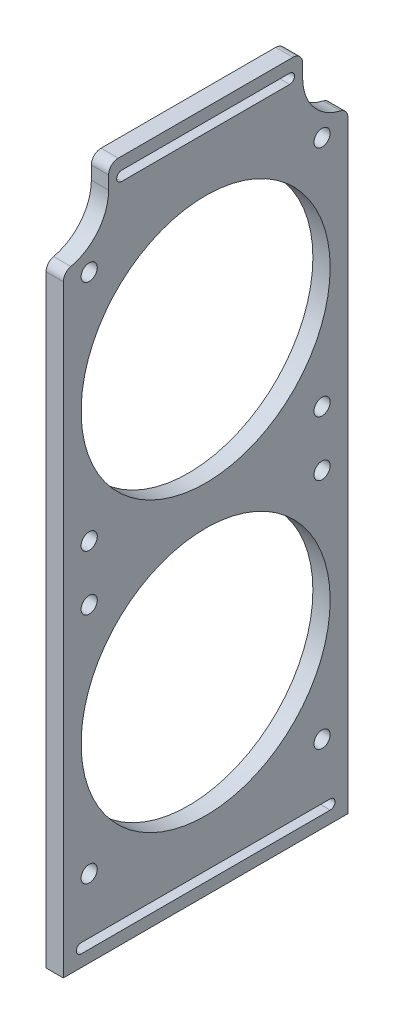
ISO-10303-21;
HEADER;
FILE_DESCRIPTION(('STEP AP214'),'2;1');
FILE_NAME('part.step','',(''),(''),'','','');
FILE_SCHEMA(('AUTOMOTIVE_DESIGN { 1 0 10303 214 1 1 1 1 }'));
ENDSEC;
DATA;
#1=APPLICATION_CONTEXT('core data for automotive mechanical design processes');
#2=APPLICATION_PROTOCOL_DEFINITION('international standard','automotive_design',2000,#1);
#3=PRODUCT_CONTEXT('',#1,'mechanical');
#4=PRODUCT('Part','Part','',(#3));
#5=PRODUCT_RELATED_PRODUCT_CATEGORY('part','',(#4));
#6=PRODUCT_DEFINITION_FORMATION('','',#4);
#7=PRODUCT_DEFINITION_CONTEXT('part definition',#1,'design');
#8=PRODUCT_DEFINITION('design','',#6,#7);
#9=PRODUCT_DEFINITION_SHAPE('','',#8);
#10=(LENGTH_UNIT() NAMED_UNIT(*) SI_UNIT(.MILLI.,.METRE.));
#11=(NAMED_UNIT(*) PLANE_ANGLE_UNIT() SI_UNIT($,.RADIAN.));
#12=(NAMED_UNIT(*) SI_UNIT($,.STERADIAN.) SOLID_ANGLE_UNIT());
#13=UNCERTAINTY_MEASURE_WITH_UNIT(LENGTH_MEASURE(1.E-05),#10,'distance_accuracy_value','');
#14=(GEOMETRIC_REPRESENTATION_CONTEXT(3) GLOBAL_UNCERTAINTY_ASSIGNED_CONTEXT((#13)) GLOBAL_UNIT_ASSIGNED_CONTEXT((#10,
#11,#12)) REPRESENTATION_CONTEXT('',''));
#15=CARTESIAN_POINT('',(0.,0.,0.));
#16=DIRECTION('',(0.,0.,1.));
#17=DIRECTION('',(1.,0.,0.));
#18=AXIS2_PLACEMENT_3D('',#15,#16,#17);
#19=CARTESIAN_POINT('',(5.334,0.,0.));
#20=DIRECTION('',(1.,0.,0.));
#21=DIRECTION('',(0.,0.,-1.));
#22=AXIS2_PLACEMENT_3D('',#19,#20,#21);
#23=PLANE('',#22);
#24=CARTESIAN_POINT('',(5.334,90.3907369232384,-34.4908597531381));
#25=DIRECTION('',(-1.,0.,0.));
#26=DIRECTION('',(0.,0.,1.));
#27=AXIS2_PLACEMENT_3D('',#24,#25,#26);
#28=CIRCLE('',#27,2.5);
#29=CARTESIAN_POINT('',(5.334,90.3907369232384,-31.9908597531381));
#30=VERTEX_POINT('',#29);
#31=EDGE_CURVE('E785',#30,#30,#28,.T.);
#32=ORIENTED_EDGE('',*,*,#31,.T.);
#33=EDGE_LOOP('',(#32));
#34=FACE_BOUND('',#33,.T.);
#35=CARTESIAN_POINT('',(5.334,90.3907369232384,37.5091402468618));
#36=DIRECTION('',(-1.,0.,0.));
#37=DIRECTION('',(0.,0.,1.));
#38=AXIS2_PLACEMENT_3D('',#35,#36,#37);
#39=CIRCLE('',#38,2.5);
#40=CARTESIAN_POINT('',(5.334,90.3907369232384,40.0091402468618));
#41=VERTEX_POINT('',#40);
#42=EDGE_CURVE('E779',#41,#41,#39,.T.);
#43=ORIENTED_EDGE('',*,*,#42,.T.);
#44=EDGE_LOOP('',(#43));
#45=FACE_BOUND('',#44,.T.);
#46=CARTESIAN_POINT('',(5.334,18.3907369232386,-34.4908597531381));
#47=DIRECTION('',(-1.,0.,0.));
#48=DIRECTION('',(0.,0.,1.));
#49=AXIS2_PLACEMENT_3D('',#46,#47,#48);
#50=CIRCLE('',#49,2.5);
#51=CARTESIAN_POINT('',(5.334,18.3907369232386,-31.9908597531381));
#52=VERTEX_POINT('',#51);
#53=EDGE_CURVE('E773',#52,#52,#50,.T.);
#54=ORIENTED_EDGE('',*,*,#53,.T.);
#55=EDGE_LOOP('',(#54));
#56=FACE_BOUND('',#55,.T.);
#57=CARTESIAN_POINT('',(5.334,18.3907369232386,37.5091402468618));
#58=DIRECTION('',(-1.,0.,0.));
#59=DIRECTION('',(0.,0.,1.));
#60=AXIS2_PLACEMENT_3D('',#57,#58,#59);
#61=CIRCLE('',#60,2.5);
#62=CARTESIAN_POINT('',(5.334,18.3907369232386,40.0091402468618));
#63=VERTEX_POINT('',#62);
#64=EDGE_CURVE('E767',#63,#63,#61,.T.);
#65=ORIENTED_EDGE('',*,*,#64,.T.);
#66=EDGE_LOOP('',(#65));
#67=FACE_BOUND('',#66,.T.);
#68=CARTESIAN_POINT('',(5.334,1.32381761759778,37.5091402468619));
#69=DIRECTION('',(-1.,0.,0.));
#70=DIRECTION('',(0.,0.,1.));
#71=AXIS2_PLACEMENT_3D('',#68,#69,#70);
#72=CIRCLE('',#71,2.5);
#73=CARTESIAN_POINT('',(5.334,1.32381761759778,40.0091402468619));
#74=VERTEX_POINT('',#73);
#75=EDGE_CURVE('E761',#74,#74,#72,.T.);
#76=ORIENTED_EDGE('',*,*,#75,.T.);
#77=EDGE_LOOP('',(#76));
#78=FACE_BOUND('',#77,.T.);
#79=CARTESIAN_POINT('',(5.334,1.32381761759781,-34.4908597531381));
#80=DIRECTION('',(-1.,0.,0.));
#81=DIRECTION('',(0.,0.,1.));
#82=AXIS2_PLACEMENT_3D('',#79,#80,#81);
#83=CIRCLE('',#82,2.5);
#84=CARTESIAN_POINT('',(5.334,1.32381761759781,-31.9908597531381));
#85=VERTEX_POINT('',#84);
#86=EDGE_CURVE('E755',#85,#85,#83,.T.);
#87=ORIENTED_EDGE('',*,*,#86,.T.);
#88=EDGE_LOOP('',(#87));
#89=FACE_BOUND('',#88,.T.);
#90=CARTESIAN_POINT('',(5.334,-70.6761823824022,-34.4908597531381));
#91=DIRECTION('',(-1.,0.,0.));
#92=DIRECTION('',(0.,0.,1.));
#93=AXIS2_PLACEMENT_3D('',#90,#91,#92);
#94=CIRCLE('',#93,2.5);
#95=CARTESIAN_POINT('',(5.334,-70.6761823824022,-31.9908597531381));
#96=VERTEX_POINT('',#95);
#97=EDGE_CURVE('E744',#96,#96,#94,.T.);
#98=ORIENTED_EDGE('',*,*,#97,.T.);
#99=EDGE_LOOP('',(#98));
#100=FACE_BOUND('',#99,.T.);
#101=CARTESIAN_POINT('',(5.334,109.357366470334,46.5091402468619));
#102=DIRECTION('',(1.,0.,0.));
#103=DIRECTION('',(0.,0.,-1.));
#104=AXIS2_PLACEMENT_3D('',#101,#102,#103);
#105=CIRCLE('',#104,15.);
#106=CARTESIAN_POINT('',(5.334,109.357366470334,31.5091402468619));
#107=VERTEX_POINT('',#106);
#108=CARTESIAN_POINT('',(5.334,94.7324258246807,43.1758069135285));
#109=VERTEX_POINT('',#108);
#110=EDGE_CURVE('E445',#107,#109,#105,.F.);
#111=ORIENTED_EDGE('',*,*,#110,.T.);
#112=CARTESIAN_POINT('',(5.334,91.80743769555,42.5091402468619));
#113=DIRECTION('',(1.,0.,0.));
#114=DIRECTION('',(0.,0.,-1.));
#115=AXIS2_PLACEMENT_3D('',#112,#113,#114);
#116=CIRCLE('',#115,3.);
#117=CARTESIAN_POINT('',(5.334,91.80743769555,45.5091402468619));
#118=VERTEX_POINT('',#117);
#119=EDGE_CURVE('E471',#109,#118,#116,.T.);
#120=ORIENTED_EDGE('',*,*,#119,.T.);
#121=DIRECTION('',(0.,1.,0.));
#122=VECTOR('',#121,1.);
#123=CARTESIAN_POINT('',(5.334,0.,45.5091402468619));
#124=LINE('',#123,#122);
#125=CARTESIAN_POINT('',(5.334,-94.6179244086881,45.5091402468619));
#126=VERTEX_POINT('',#125);
#127=EDGE_CURVE('E405',#126,#118,#124,.T.);
#128=ORIENTED_EDGE('',*,*,#127,.F.);
#129=DIRECTION('',(0.,0.,1.));
#130=VECTOR('',#129,1.);
#131=CARTESIAN_POINT('',(5.334,-94.6179244086881,0.));
#132=LINE('',#131,#130);
#133=CARTESIAN_POINT('',(5.334,-94.6179244086881,-42.4908597531381));
#134=VERTEX_POINT('',#133);
#135=EDGE_CURVE('E408',#134,#126,#132,.T.);
#136=ORIENTED_EDGE('',*,*,#135,.F.);
#137=DIRECTION('',(0.,1.,0.));
#138=VECTOR('',#137,1.);
#139=CARTESIAN_POINT('',(5.334,0.,-42.4908597531381));
#140=LINE('',#139,#138);
#141=CARTESIAN_POINT('',(5.334,91.80743769555,-42.4908597531381));
#142=VERTEX_POINT('',#141);
#143=EDGE_CURVE('E411',#134,#142,#140,.T.);
#144=ORIENTED_EDGE('',*,*,#143,.T.);
#145=CARTESIAN_POINT('',(5.334,91.80743769555,-39.4908597531381));
#146=DIRECTION('',(1.,0.,0.));
#147=DIRECTION('',(0.,0.,-1.));
#148=AXIS2_PLACEMENT_3D('',#145,#146,#147);
#149=CIRCLE('',#148,3.);
#150=CARTESIAN_POINT('',(5.334,94.7324258246807,-40.1575264198048));
#151=VERTEX_POINT('',#150);
#152=EDGE_CURVE('E197',#142,#151,#149,.T.);
#153=ORIENTED_EDGE('',*,*,#152,.T.);
#154=CARTESIAN_POINT('',(5.334,109.357366470334,-43.4908597531381));
#155=DIRECTION('',(1.,0.,0.));
#156=DIRECTION('',(0.,0.,-1.));
#157=AXIS2_PLACEMENT_3D('',#154,#155,#156);
#158=CIRCLE('',#157,15.);
#159=CARTESIAN_POINT('',(5.334,109.357366470334,-28.4908597531381));
#160=VERTEX_POINT('',#159);
#161=EDGE_CURVE('E451',#151,#160,#158,.F.);
#162=ORIENTED_EDGE('',*,*,#161,.T.);
#163=DIRECTION('',(0.,-1.,0.));
#164=VECTOR('',#163,1.);
#165=CARTESIAN_POINT('',(5.334,0.,-28.4908597531381));
#166=LINE('',#165,#164);
#167=CARTESIAN_POINT('',(5.334,113.41661686336,-28.4908597531381));
#168=VERTEX_POINT('',#167);
#169=EDGE_CURVE('E397',#168,#160,#166,.T.);
#170=ORIENTED_EDGE('',*,*,#169,.F.);
#171=CARTESIAN_POINT('',(5.334,113.41661686336,-25.4908597531381));
#172=DIRECTION('',(1.,0.,0.));
#173=DIRECTION('',(0.,0.,-1.));
#174=AXIS2_PLACEMENT_3D('',#171,#172,#173);
#175=CIRCLE('',#174,3.);
#176=CARTESIAN_POINT('',(5.334,116.41661686336,-25.4908597531381));
#177=VERTEX_POINT('',#176);
#178=EDGE_CURVE('E467',#168,#177,#175,.T.);
#179=ORIENTED_EDGE('',*,*,#178,.T.);
#180=DIRECTION('',(0.,0.,-1.));
#181=VECTOR('',#180,1.);
#182=CARTESIAN_POINT('',(5.334,116.41661686336,0.));
#183=LINE('',#182,#181);
#184=CARTESIAN_POINT('',(5.334,116.41661686336,28.5091402468619));
#185=VERTEX_POINT('',#184);
#186=EDGE_CURVE('E400',#185,#177,#183,.T.);
#187=ORIENTED_EDGE('',*,*,#186,.F.);
#188=CARTESIAN_POINT('',(5.334,113.41661686336,28.5091402468619));
#189=DIRECTION('',(1.,0.,0.));
#190=DIRECTION('',(0.,0.,-1.));
#191=AXIS2_PLACEMENT_3D('',#188,#189,#190);
#192=CIRCLE('',#191,3.);
#193=CARTESIAN_POINT('',(5.334,113.41661686336,31.5091402468619));
#194=VERTEX_POINT('',#193);
#195=EDGE_CURVE('E469',#185,#194,#192,.T.);
#196=ORIENTED_EDGE('',*,*,#195,.T.);
#197=DIRECTION('',(0.,-1.,0.));
#198=VECTOR('',#197,1.);
#199=CARTESIAN_POINT('',(5.334,0.,31.5091402468619));
#200=LINE('',#199,#198);
#201=EDGE_CURVE('E403',#194,#107,#200,.T.);
#202=ORIENTED_EDGE('',*,*,#201,.T.);
#203=EDGE_LOOP('',(#111,#120,#128,#136,#144,#153,#162,#170,#179,#187,#196,#202));
#204=FACE_BOUND('',#203,.T.);
#205=CARTESIAN_POINT('',(5.334,-34.6761823824022,1.5091402468619));
#206=DIRECTION('',(1.,0.,0.));
#207=DIRECTION('',(0.,0.,-1.));
#208=AXIS2_PLACEMENT_3D('',#205,#206,#207);
#209=CIRCLE('',#208,38.5);
#210=CARTESIAN_POINT('',(5.334,-34.6761823824022,-36.9908597531381));
#211=VERTEX_POINT('',#210);
#212=EDGE_CURVE('E393',#211,#211,#209,.T.);
#213=ORIENTED_EDGE('',*,*,#212,.F.);
#214=EDGE_LOOP('',(#213));
#215=FACE_BOUND('',#214,.T.);
#216=CARTESIAN_POINT('',(5.334,54.3907369232385,1.50914024686188));
#217=DIRECTION('',(1.,0.,0.));
#218=DIRECTION('',(0.,0.,-1.));
#219=AXIS2_PLACEMENT_3D('',#216,#217,#218);
#220=CIRCLE('',#219,38.5);
#221=CARTESIAN_POINT('',(5.334,54.3907369232385,-36.9908597531381));
#222=VERTEX_POINT('',#221);
#223=EDGE_CURVE('E390',#222,#222,#220,.T.);
#224=ORIENTED_EDGE('',*,*,#223,.F.);
#225=EDGE_LOOP('',(#224));
#226=FACE_BOUND('',#225,.T.);
#227=CARTESIAN_POINT('',(5.334,-89.41563933002,39.9929002468608));
#228=DIRECTION('',(-1.,0.,0.));
#229=DIRECTION('',(0.,0.,1.));
#230=AXIS2_PLACEMENT_3D('',#227,#228,#229);
#231=CIRCLE('',#230,1.5);
#232=CARTESIAN_POINT('',(5.334,-90.91563933002,39.9929002468608));
#233=VERTEX_POINT('',#232);
#234=CARTESIAN_POINT('',(5.334,-87.91563933002,39.9929002468608));
#235=VERTEX_POINT('',#234);
#236=EDGE_CURVE('E383',#233,#235,#231,.T.);
#237=ORIENTED_EDGE('',*,*,#236,.T.);
#238=DIRECTION('',(0.,0.,1.));
#239=VECTOR('',#238,1.);
#240=CARTESIAN_POINT('',(5.334,-87.91563933002,-37.0070997531391));
#241=LINE('',#240,#239);
#242=CARTESIAN_POINT('',(5.334,-87.91563933002,-37.0070997531391));
#243=VERTEX_POINT('',#242);
#244=EDGE_CURVE('E362',#243,#235,#241,.T.);
#245=ORIENTED_EDGE('',*,*,#244,.F.);
#246=CARTESIAN_POINT('',(5.334,-89.41563933002,-37.0070997531392));
#247=DIRECTION('',(-1.,0.,0.));
#248=DIRECTION('',(0.,0.,1.));
#249=AXIS2_PLACEMENT_3D('',#246,#247,#248);
#250=CIRCLE('',#249,1.5);
#251=CARTESIAN_POINT('',(5.334,-90.91563933002,-37.0070997531391));
#252=VERTEX_POINT('',#251);
#253=EDGE_CURVE('E373',#243,#252,#250,.T.);
#254=ORIENTED_EDGE('',*,*,#253,.T.);
#255=DIRECTION('',(0.,0.,1.));
#256=VECTOR('',#255,1.);
#257=CARTESIAN_POINT('',(5.334,-90.91563933002,-37.0070997531391));
#258=LINE('',#257,#256);
#259=EDGE_CURVE('E359',#252,#233,#258,.T.);
#260=ORIENTED_EDGE('',*,*,#259,.T.);
#261=EDGE_LOOP('',(#237,#245,#254,#260));
#262=FACE_BOUND('',#261,.T.);
#263=CARTESIAN_POINT('',(5.334,111.153676893299,27.5091402468619));
#264=DIRECTION('',(-1.,0.,0.));
#265=DIRECTION('',(0.,0.,1.));
#266=AXIS2_PLACEMENT_3D('',#263,#264,#265);
#267=CIRCLE('',#266,1.5);
#268=CARTESIAN_POINT('',(5.334,109.653676893299,27.5091402468619));
#269=VERTEX_POINT('',#268);
#270=CARTESIAN_POINT('',(5.334,112.653676893299,27.5091402468619));
#271=VERTEX_POINT('',#270);
#272=EDGE_CURVE('E351',#269,#271,#267,.T.);
#273=ORIENTED_EDGE('',*,*,#272,.T.);
#274=DIRECTION('',(0.,0.,1.));
#275=VECTOR('',#274,1.);
#276=CARTESIAN_POINT('',(5.334,112.653676893299,-24.4908597531381));
#277=LINE('',#276,#275);
#278=CARTESIAN_POINT('',(5.334,112.653676893299,-24.4908597531381));
#279=VERTEX_POINT('',#278);
#280=EDGE_CURVE('E330',#279,#271,#277,.T.);
#281=ORIENTED_EDGE('',*,*,#280,.F.);
#282=CARTESIAN_POINT('',(5.334,111.153676893299,-24.4908597531381));
#283=DIRECTION('',(-1.,0.,0.));
#284=DIRECTION('',(0.,0.,1.));
#285=AXIS2_PLACEMENT_3D('',#282,#283,#284);
#286=CIRCLE('',#285,1.5);
#287=CARTESIAN_POINT('',(5.334,109.653676893299,-24.4908597531381));
#288=VERTEX_POINT('',#287);
#289=EDGE_CURVE('E339',#279,#288,#286,.T.);
#290=ORIENTED_EDGE('',*,*,#289,.T.);
#291=DIRECTION('',(0.,0.,1.));
#292=VECTOR('',#291,1.);
#293=CARTESIAN_POINT('',(5.334,109.653676893299,-24.4908597531381));
#294=LINE('',#293,#292);
#295=EDGE_CURVE('E741',#288,#269,#294,.T.);
#296=ORIENTED_EDGE('',*,*,#295,.T.);
#297=EDGE_LOOP('',(#273,#281,#290,#296));
#298=FACE_BOUND('',#297,.T.);
#299=CARTESIAN_POINT('',(5.334,-70.6761823824022,37.5091402468619));
#300=DIRECTION('',(-1.,0.,0.));
#301=DIRECTION('',(0.,0.,1.));
#302=AXIS2_PLACEMENT_3D('',#299,#300,#301);
#303=CIRCLE('',#302,2.5);
#304=CARTESIAN_POINT('',(5.334,-70.6761823824022,40.0091402468619));
#305=VERTEX_POINT('',#304);
#306=EDGE_CURVE('E738',#305,#305,#303,.T.);
#307=ORIENTED_EDGE('',*,*,#306,.T.);
#308=EDGE_LOOP('',(#307));
#309=FACE_BOUND('',#308,.T.);
#310=ADVANCED_FACE('F182',(#34,#45,#56,#67,#78,#89,#100,#204,#215,#226,#262,#298,#309),#23,.T.);
#311=CARTESIAN_POINT('',(0.,0.,0.));
#312=DIRECTION('',(1.,0.,0.));
#313=DIRECTION('',(0.,0.,-1.));
#314=AXIS2_PLACEMENT_3D('',#311,#312,#313);
#315=PLANE('',#314);
#316=CARTESIAN_POINT('',(0.,90.3907369232384,-34.4908597531381));
#317=DIRECTION('',(-1.,0.,0.));
#318=DIRECTION('',(0.,0.,1.));
#319=AXIS2_PLACEMENT_3D('',#316,#317,#318);
#320=CIRCLE('',#319,2.5);
#321=CARTESIAN_POINT('',(0.,90.3907369232384,-31.9908597531381));
#322=VERTEX_POINT('',#321);
#323=EDGE_CURVE('E787',#322,#322,#320,.T.);
#324=ORIENTED_EDGE('',*,*,#323,.F.);
#325=EDGE_LOOP('',(#324));
#326=FACE_BOUND('',#325,.T.);
#327=CARTESIAN_POINT('',(0.,90.3907369232384,37.5091402468618));
#328=DIRECTION('',(-1.,0.,0.));
#329=DIRECTION('',(0.,0.,1.));
#330=AXIS2_PLACEMENT_3D('',#327,#328,#329);
#331=CIRCLE('',#330,2.5);
#332=CARTESIAN_POINT('',(0.,90.3907369232384,40.0091402468618));
#333=VERTEX_POINT('',#332);
#334=EDGE_CURVE('E782',#333,#333,#331,.T.);
#335=ORIENTED_EDGE('',*,*,#334,.F.);
#336=EDGE_LOOP('',(#335));
#337=FACE_BOUND('',#336,.T.);
#338=CARTESIAN_POINT('',(0.,18.3907369232386,-34.4908597531381));
#339=DIRECTION('',(-1.,0.,0.));
#340=DIRECTION('',(0.,0.,1.));
#341=AXIS2_PLACEMENT_3D('',#338,#339,#340);
#342=CIRCLE('',#341,2.5);
#343=CARTESIAN_POINT('',(0.,18.3907369232386,-31.9908597531381));
#344=VERTEX_POINT('',#343);
#345=EDGE_CURVE('E776',#344,#344,#342,.T.);
#346=ORIENTED_EDGE('',*,*,#345,.F.);
#347=EDGE_LOOP('',(#346));
#348=FACE_BOUND('',#347,.T.);
#349=CARTESIAN_POINT('',(0.,18.3907369232386,37.5091402468618));
#350=DIRECTION('',(-1.,0.,0.));
#351=DIRECTION('',(0.,0.,1.));
#352=AXIS2_PLACEMENT_3D('',#349,#350,#351);
#353=CIRCLE('',#352,2.5);
#354=CARTESIAN_POINT('',(0.,18.3907369232386,40.0091402468618));
#355=VERTEX_POINT('',#354);
#356=EDGE_CURVE('E770',#355,#355,#353,.T.);
#357=ORIENTED_EDGE('',*,*,#356,.F.);
#358=EDGE_LOOP('',(#357));
#359=FACE_BOUND('',#358,.T.);
#360=CARTESIAN_POINT('',(0.,1.32381761759778,37.5091402468619));
#361=DIRECTION('',(-1.,0.,0.));
#362=DIRECTION('',(0.,0.,1.));
#363=AXIS2_PLACEMENT_3D('',#360,#361,#362);
#364=CIRCLE('',#363,2.5);
#365=CARTESIAN_POINT('',(0.,1.32381761759778,40.0091402468619));
#366=VERTEX_POINT('',#365);
#367=EDGE_CURVE('E764',#366,#366,#364,.T.);
#368=ORIENTED_EDGE('',*,*,#367,.F.);
#369=EDGE_LOOP('',(#368));
#370=FACE_BOUND('',#369,.T.);
#371=CARTESIAN_POINT('',(0.,1.32381761759781,-34.4908597531381));
#372=DIRECTION('',(-1.,0.,0.));
#373=DIRECTION('',(0.,0.,1.));
#374=AXIS2_PLACEMENT_3D('',#371,#372,#373);
#375=CIRCLE('',#374,2.5);
#376=CARTESIAN_POINT('',(0.,1.32381761759781,-31.9908597531381));
#377=VERTEX_POINT('',#376);
#378=EDGE_CURVE('E758',#377,#377,#375,.T.);
#379=ORIENTED_EDGE('',*,*,#378,.F.);
#380=EDGE_LOOP('',(#379));
#381=FACE_BOUND('',#380,.T.);
#382=CARTESIAN_POINT('',(0.,-70.6761823824022,-34.4908597531381));
#383=DIRECTION('',(-1.,0.,0.));
#384=DIRECTION('',(0.,0.,1.));
#385=AXIS2_PLACEMENT_3D('',#382,#383,#384);
#386=CIRCLE('',#385,2.5);
#387=CARTESIAN_POINT('',(0.,-70.6761823824022,-31.9908597531381));
#388=VERTEX_POINT('',#387);
#389=EDGE_CURVE('E752',#388,#388,#386,.T.);
#390=ORIENTED_EDGE('',*,*,#389,.F.);
#391=EDGE_LOOP('',(#390));
#392=FACE_BOUND('',#391,.T.);
#393=CARTESIAN_POINT('',(0.,-70.6761823824022,37.5091402468619));
#394=DIRECTION('',(-1.,0.,0.));
#395=DIRECTION('',(0.,0.,1.));
#396=AXIS2_PLACEMENT_3D('',#393,#394,#395);
#397=CIRCLE('',#396,2.5);
#398=CARTESIAN_POINT('',(0.,-70.6761823824022,40.0091402468619));
#399=VERTEX_POINT('',#398);
#400=EDGE_CURVE('E739',#399,#399,#397,.T.);
#401=ORIENTED_EDGE('',*,*,#400,.F.);
#402=EDGE_LOOP('',(#401));
#403=FACE_BOUND('',#402,.T.);
#404=DIRECTION('',(0.,0.,1.));
#405=VECTOR('',#404,1.);
#406=CARTESIAN_POINT('',(0.,-87.91563933002,-37.0070997531391));
#407=LINE('',#406,#405);
#408=CARTESIAN_POINT('',(0.,-87.91563933002,-37.0070997531391));
#409=VERTEX_POINT('',#408);
#410=CARTESIAN_POINT('',(0.,-87.91563933002,39.9929002468608));
#411=VERTEX_POINT('',#410);
#412=EDGE_CURVE('E365',#409,#411,#407,.T.);
#413=ORIENTED_EDGE('',*,*,#412,.T.);
#414=CARTESIAN_POINT('',(0.,-89.41563933002,39.9929002468608));
#415=DIRECTION('',(-1.,0.,0.));
#416=DIRECTION('',(0.,0.,1.));
#417=AXIS2_PLACEMENT_3D('',#414,#415,#416);
#418=CIRCLE('',#417,1.49999999999999);
#419=CARTESIAN_POINT('',(0.,-90.91563933002,39.9929002468608));
#420=VERTEX_POINT('',#419);
#421=EDGE_CURVE('E381',#420,#411,#418,.T.);
#422=ORIENTED_EDGE('',*,*,#421,.F.);
#423=DIRECTION('',(0.,0.,1.));
#424=VECTOR('',#423,1.);
#425=CARTESIAN_POINT('',(0.,-90.91563933002,-37.0070997531391));
#426=LINE('',#425,#424);
#427=CARTESIAN_POINT('',(0.,-90.91563933002,-37.0070997531391));
#428=VERTEX_POINT('',#427);
#429=EDGE_CURVE('E357',#428,#420,#426,.T.);
#430=ORIENTED_EDGE('',*,*,#429,.F.);
#431=CARTESIAN_POINT('',(0.,-89.41563933002,-37.0070997531392));
#432=DIRECTION('',(-1.,0.,0.));
#433=DIRECTION('',(0.,0.,1.));
#434=AXIS2_PLACEMENT_3D('',#431,#432,#433);
#435=CIRCLE('',#434,1.49999999999999);
#436=EDGE_CURVE('E371',#409,#428,#435,.T.);
#437=ORIENTED_EDGE('',*,*,#436,.F.);
#438=EDGE_LOOP('',(#413,#422,#430,#437));
#439=FACE_BOUND('',#438,.T.);
#440=CARTESIAN_POINT('',(0.,54.3907369232385,1.50914024686188));
#441=DIRECTION('',(1.,0.,0.));
#442=DIRECTION('',(0.,0.,-1.));
#443=AXIS2_PLACEMENT_3D('',#440,#441,#442);
#444=CIRCLE('',#443,38.5);
#445=CARTESIAN_POINT('',(0.,54.3907369232385,-36.9908597531381));
#446=VERTEX_POINT('',#445);
#447=EDGE_CURVE('E389',#446,#446,#444,.T.);
#448=ORIENTED_EDGE('',*,*,#447,.T.);
#449=EDGE_LOOP('',(#448));
#450=FACE_BOUND('',#449,.T.);
#451=CARTESIAN_POINT('',(0.,-34.6761823824022,1.5091402468619));
#452=DIRECTION('',(1.,0.,0.));
#453=DIRECTION('',(0.,0.,-1.));
#454=AXIS2_PLACEMENT_3D('',#451,#452,#453);
#455=CIRCLE('',#454,38.5);
#456=CARTESIAN_POINT('',(0.,-34.6761823824022,-36.9908597531381));
#457=VERTEX_POINT('',#456);
#458=EDGE_CURVE('E416',#457,#457,#455,.T.);
#459=ORIENTED_EDGE('',*,*,#458,.T.);
#460=EDGE_LOOP('',(#459));
#461=FACE_BOUND('',#460,.T.);
#462=DIRECTION('',(0.,1.,0.));
#463=VECTOR('',#462,1.);
#464=CARTESIAN_POINT('',(0.,0.,45.5091402468619));
#465=LINE('',#464,#463);
#466=CARTESIAN_POINT('',(0.,-94.6179244086881,45.5091402468619));
#467=VERTEX_POINT('',#466);
#468=CARTESIAN_POINT('',(0.,91.80743769555,45.5091402468619));
#469=VERTEX_POINT('',#468);
#470=EDGE_CURVE('E426',#467,#469,#465,.T.);
#471=ORIENTED_EDGE('',*,*,#470,.T.);
#472=CARTESIAN_POINT('',(0.,91.80743769555,42.5091402468619));
#473=DIRECTION('',(1.,0.,0.));
#474=DIRECTION('',(0.,0.,-1.));
#475=AXIS2_PLACEMENT_3D('',#472,#473,#474);
#476=CIRCLE('',#475,3.);
#477=CARTESIAN_POINT('',(0.,94.7324258246807,43.1758069135285));
#478=VERTEX_POINT('',#477);
#479=EDGE_CURVE('E462',#469,#478,#476,.F.);
#480=ORIENTED_EDGE('',*,*,#479,.T.);
#481=CARTESIAN_POINT('',(0.,109.357366470334,46.5091402468619));
#482=DIRECTION('',(1.,0.,0.));
#483=DIRECTION('',(0.,0.,-1.));
#484=AXIS2_PLACEMENT_3D('',#481,#482,#483);
#485=CIRCLE('',#484,15.);
#486=CARTESIAN_POINT('',(0.,109.357366470334,31.5091402468619));
#487=VERTEX_POINT('',#486);
#488=EDGE_CURVE('E442',#478,#487,#485,.T.);
#489=ORIENTED_EDGE('',*,*,#488,.T.);
#490=DIRECTION('',(0.,-1.,0.));
#491=VECTOR('',#490,1.);
#492=CARTESIAN_POINT('',(0.,0.,31.5091402468619));
#493=LINE('',#492,#491);
#494=CARTESIAN_POINT('',(0.,113.41661686336,31.5091402468619));
#495=VERTEX_POINT('',#494);
#496=EDGE_CURVE('E424',#495,#487,#493,.T.);
#497=ORIENTED_EDGE('',*,*,#496,.F.);
#498=CARTESIAN_POINT('',(0.,113.41661686336,28.5091402468619));
#499=DIRECTION('',(1.,0.,0.));
#500=DIRECTION('',(0.,0.,-1.));
#501=AXIS2_PLACEMENT_3D('',#498,#499,#500);
#502=CIRCLE('',#501,3.);
#503=CARTESIAN_POINT('',(0.,116.41661686336,28.5091402468619));
#504=VERTEX_POINT('',#503);
#505=EDGE_CURVE('E460',#495,#504,#502,.F.);
#506=ORIENTED_EDGE('',*,*,#505,.T.);
#507=DIRECTION('',(0.,0.,-1.));
#508=VECTOR('',#507,1.);
#509=CARTESIAN_POINT('',(0.,116.41661686336,0.));
#510=LINE('',#509,#508);
#511=CARTESIAN_POINT('',(0.,116.41661686336,-25.4908597531381));
#512=VERTEX_POINT('',#511);
#513=EDGE_CURVE('E421',#504,#512,#510,.T.);
#514=ORIENTED_EDGE('',*,*,#513,.T.);
#515=CARTESIAN_POINT('',(0.,113.41661686336,-25.4908597531381));
#516=DIRECTION('',(1.,0.,0.));
#517=DIRECTION('',(0.,0.,-1.));
#518=AXIS2_PLACEMENT_3D('',#515,#516,#517);
#519=CIRCLE('',#518,3.);
#520=CARTESIAN_POINT('',(0.,113.41661686336,-28.4908597531381));
#521=VERTEX_POINT('',#520);
#522=EDGE_CURVE('E458',#512,#521,#519,.F.);
#523=ORIENTED_EDGE('',*,*,#522,.T.);
#524=DIRECTION('',(0.,-1.,0.));
#525=VECTOR('',#524,1.);
#526=CARTESIAN_POINT('',(0.,0.,-28.4908597531381));
#527=LINE('',#526,#525);
#528=CARTESIAN_POINT('',(0.,109.357366470334,-28.4908597531381));
#529=VERTEX_POINT('',#528);
#530=EDGE_CURVE('E419',#521,#529,#527,.T.);
#531=ORIENTED_EDGE('',*,*,#530,.T.);
#532=CARTESIAN_POINT('',(0.,109.357366470334,-43.4908597531381));
#533=DIRECTION('',(1.,0.,0.));
#534=DIRECTION('',(0.,0.,-1.));
#535=AXIS2_PLACEMENT_3D('',#532,#533,#534);
#536=CIRCLE('',#535,15.);
#537=CARTESIAN_POINT('',(0.,94.7324258246807,-40.1575264198048));
#538=VERTEX_POINT('',#537);
#539=EDGE_CURVE('E448',#529,#538,#536,.T.);
#540=ORIENTED_EDGE('',*,*,#539,.T.);
#541=CARTESIAN_POINT('',(0.,91.80743769555,-39.4908597531381));
#542=DIRECTION('',(1.,0.,0.));
#543=DIRECTION('',(0.,0.,-1.));
#544=AXIS2_PLACEMENT_3D('',#541,#542,#543);
#545=CIRCLE('',#544,3.);
#546=CARTESIAN_POINT('',(0.,91.80743769555,-42.4908597531381));
#547=VERTEX_POINT('',#546);
#548=EDGE_CURVE('E456',#538,#547,#545,.F.);
#549=ORIENTED_EDGE('',*,*,#548,.T.);
#550=DIRECTION('',(0.,1.,0.));
#551=VECTOR('',#550,1.);
#552=CARTESIAN_POINT('',(0.,0.,-42.4908597531381));
#553=LINE('',#552,#551);
#554=CARTESIAN_POINT('',(0.,-94.6179244086881,-42.4908597531381));
#555=VERTEX_POINT('',#554);
#556=EDGE_CURVE('E394',#555,#547,#553,.T.);
#557=ORIENTED_EDGE('',*,*,#556,.F.);
#558=DIRECTION('',(0.,0.,1.));
#559=VECTOR('',#558,1.);
#560=CARTESIAN_POINT('',(0.,-94.6179244086881,0.));
#561=LINE('',#560,#559);
#562=EDGE_CURVE('E429',#555,#467,#561,.T.);
#563=ORIENTED_EDGE('',*,*,#562,.T.);
#564=EDGE_LOOP('',(#471,#480,#489,#497,#506,#514,#523,#531,#540,#549,#557,#563));
#565=FACE_BOUND('',#564,.T.);
#566=DIRECTION('',(0.,0.,1.));
#567=VECTOR('',#566,1.);
#568=CARTESIAN_POINT('',(0.,109.653676893299,-24.4908597531381));
#569=LINE('',#568,#567);
#570=CARTESIAN_POINT('',(0.,109.653676893299,-24.4908597531381));
#571=VERTEX_POINT('',#570);
#572=CARTESIAN_POINT('',(0.,109.653676893299,27.5091402468619));
#573=VERTEX_POINT('',#572);
#574=EDGE_CURVE('E342',#571,#573,#569,.T.);
#575=ORIENTED_EDGE('',*,*,#574,.F.);
#576=CARTESIAN_POINT('',(0.,111.153676893299,-24.4908597531381));
#577=DIRECTION('',(-1.,0.,0.));
#578=DIRECTION('',(0.,0.,1.));
#579=AXIS2_PLACEMENT_3D('',#576,#577,#578);
#580=CIRCLE('',#579,1.49999999999999);
#581=CARTESIAN_POINT('',(0.,112.653676893299,-24.4908597531381));
#582=VERTEX_POINT('',#581);
#583=EDGE_CURVE('E336',#582,#571,#580,.T.);
#584=ORIENTED_EDGE('',*,*,#583,.F.);
#585=DIRECTION('',(0.,0.,1.));
#586=VECTOR('',#585,1.);
#587=CARTESIAN_POINT('',(0.,112.653676893299,-24.4908597531381));
#588=LINE('',#587,#586);
#589=CARTESIAN_POINT('',(0.,112.653676893299,27.5091402468619));
#590=VERTEX_POINT('',#589);
#591=EDGE_CURVE('E319',#582,#590,#588,.T.);
#592=ORIENTED_EDGE('',*,*,#591,.T.);
#593=CARTESIAN_POINT('',(0.,111.153676893299,27.5091402468619));
#594=DIRECTION('',(-1.,0.,0.));
#595=DIRECTION('',(0.,0.,1.));
#596=AXIS2_PLACEMENT_3D('',#593,#594,#595);
#597=CIRCLE('',#596,1.49999999999999);
#598=EDGE_CURVE('E349',#573,#590,#597,.T.);
#599=ORIENTED_EDGE('',*,*,#598,.F.);
#600=EDGE_LOOP('',(#575,#584,#592,#599));
#601=FACE_BOUND('',#600,.T.);
#602=ADVANCED_FACE('F341',(#326,#337,#348,#359,#370,#381,#392,#403,#439,#450,#461,#565,#601),
#315,.F.);
#603=CARTESIAN_POINT('',(5.334,0.,-28.4908597531381));
#604=DIRECTION('',(0.,0.,-1.));
#605=DIRECTION('',(0.,1.,0.));
#606=AXIS2_PLACEMENT_3D('',#603,#604,#605);
#607=PLANE('',#606);
#608=ORIENTED_EDGE('',*,*,#530,.F.);
#609=DIRECTION('',(-1.,0.,0.));
#610=VECTOR('',#609,1.);
#611=CARTESIAN_POINT('',(5.334,113.41661686336,-28.4908597531381));
#612=LINE('',#611,#610);
#613=EDGE_CURVE('E481',#521,#168,#612,.F.);
#614=ORIENTED_EDGE('',*,*,#613,.T.);
#615=ORIENTED_EDGE('',*,*,#169,.T.);
#616=DIRECTION('',(1.,0.,0.));
#617=VECTOR('',#616,1.);
#618=CARTESIAN_POINT('',(0.,109.357366470334,-28.4908597531381));
#619=LINE('',#618,#617);
#620=EDGE_CURVE('E439',#160,#529,#619,.F.);
#621=ORIENTED_EDGE('',*,*,#620,.T.);
#622=EDGE_LOOP('',(#608,#614,#615,#621));
#623=FACE_BOUND('',#622,.T.);
#624=ADVANCED_FACE('F494',(#623),#607,.T.);
#625=CARTESIAN_POINT('',(5.334,116.41661686336,0.));
#626=DIRECTION('',(0.,1.,0.));
#627=DIRECTION('',(0.,0.,1.));
#628=AXIS2_PLACEMENT_3D('',#625,#626,#627);
#629=PLANE('',#628);
#630=ORIENTED_EDGE('',*,*,#513,.F.);
#631=DIRECTION('',(-1.,0.,0.));
#632=VECTOR('',#631,1.);
#633=CARTESIAN_POINT('',(5.334,116.41661686336,28.5091402468619));
#634=LINE('',#633,#632);
#635=EDGE_CURVE('E479',#504,#185,#634,.F.);
#636=ORIENTED_EDGE('',*,*,#635,.T.);
#637=ORIENTED_EDGE('',*,*,#186,.T.);
#638=DIRECTION('',(-1.,0.,0.));
#639=VECTOR('',#638,1.);
#640=CARTESIAN_POINT('',(5.334,116.41661686336,-25.4908597531381));
#641=LINE('',#640,#639);
#642=EDGE_CURVE('E476',#177,#512,#641,.T.);
#643=ORIENTED_EDGE('',*,*,#642,.T.);
#644=EDGE_LOOP('',(#630,#636,#637,#643));
#645=FACE_BOUND('',#644,.T.);
#646=ADVANCED_FACE('F505',(#645),#629,.T.);
#647=CARTESIAN_POINT('',(5.334,0.,31.5091402468619));
#648=DIRECTION('',(0.,0.,-1.));
#649=DIRECTION('',(-1.,0.,0.));
#650=AXIS2_PLACEMENT_3D('',#647,#648,#649);
#651=PLANE('',#650);
#652=ORIENTED_EDGE('',*,*,#201,.F.);
#653=DIRECTION('',(-1.,0.,0.));
#654=VECTOR('',#653,1.);
#655=CARTESIAN_POINT('',(0.,113.41661686336,31.5091402468619));
#656=LINE('',#655,#654);
#657=EDGE_CURVE('E473',#194,#495,#656,.T.);
#658=ORIENTED_EDGE('',*,*,#657,.T.);
#659=ORIENTED_EDGE('',*,*,#496,.T.);
#660=DIRECTION('',(-1.,0.,0.));
#661=VECTOR('',#660,1.);
#662=CARTESIAN_POINT('',(5.334,109.357366470334,31.5091402468619));
#663=LINE('',#662,#661);
#664=EDGE_CURVE('E436',#487,#107,#663,.F.);
#665=ORIENTED_EDGE('',*,*,#664,.T.);
#666=EDGE_LOOP('',(#652,#658,#659,#665));
#667=FACE_BOUND('',#666,.T.);
#668=ADVANCED_FACE('F512',(#667),#651,.F.);
#669=CARTESIAN_POINT('',(5.334,0.,45.5091402468619));
#670=DIRECTION('',(0.,0.,1.));
#671=DIRECTION('',(1.,0.,0.));
#672=AXIS2_PLACEMENT_3D('',#669,#670,#671);
#673=PLANE('',#672);
#674=ORIENTED_EDGE('',*,*,#127,.T.);
#675=DIRECTION('',(1.,0.,0.));
#676=VECTOR('',#675,1.);
#677=CARTESIAN_POINT('',(0.,91.80743769555,45.5091402468619));
#678=LINE('',#677,#676);
#679=EDGE_CURVE('E453',#118,#469,#678,.F.);
#680=ORIENTED_EDGE('',*,*,#679,.T.);
#681=ORIENTED_EDGE('',*,*,#470,.F.);
#682=DIRECTION('',(-1.,0.,0.));
#683=VECTOR('',#682,1.);
#684=CARTESIAN_POINT('',(5.334,-94.6179244086881,45.5091402468619));
#685=LINE('',#684,#683);
#686=EDGE_CURVE('E434',#126,#467,#685,.T.);
#687=ORIENTED_EDGE('',*,*,#686,.F.);
#688=EDGE_LOOP('',(#674,#680,#681,#687));
#689=FACE_BOUND('',#688,.T.);
#690=ADVANCED_FACE('F527',(#689),#673,.T.);
#691=CARTESIAN_POINT('',(5.334,-94.6179244086881,0.));
#692=DIRECTION('',(0.,-1.,0.));
#693=DIRECTION('',(0.,0.,-1.));
#694=AXIS2_PLACEMENT_3D('',#691,#692,#693);
#695=PLANE('',#694);
#696=ORIENTED_EDGE('',*,*,#562,.F.);
#697=DIRECTION('',(-1.,0.,0.));
#698=VECTOR('',#697,1.);
#699=CARTESIAN_POINT('',(5.334,-94.6179244086881,-42.4908597531381));
#700=LINE('',#699,#698);
#701=EDGE_CURVE('E413',#134,#555,#700,.T.);
#702=ORIENTED_EDGE('',*,*,#701,.F.);
#703=ORIENTED_EDGE('',*,*,#135,.T.);
#704=ORIENTED_EDGE('',*,*,#686,.T.);
#705=EDGE_LOOP('',(#696,#702,#703,#704));
#706=FACE_BOUND('',#705,.T.);
#707=ADVANCED_FACE('F530',(#706),#695,.T.);
#708=CARTESIAN_POINT('',(5.334,0.,-42.4908597531381));
#709=DIRECTION('',(0.,0.,1.));
#710=DIRECTION('',(1.,0.,0.));
#711=AXIS2_PLACEMENT_3D('',#708,#709,#710);
#712=PLANE('',#711);
#713=ORIENTED_EDGE('',*,*,#556,.T.);
#714=DIRECTION('',(-1.,0.,0.));
#715=VECTOR('',#714,1.);
#716=CARTESIAN_POINT('',(5.334,91.80743769555,-42.4908597531381));
#717=LINE('',#716,#715);
#718=EDGE_CURVE('E13',#547,#142,#717,.F.);
#719=ORIENTED_EDGE('',*,*,#718,.T.);
#720=ORIENTED_EDGE('',*,*,#143,.F.);
#721=ORIENTED_EDGE('',*,*,#701,.T.);
#722=EDGE_LOOP('',(#713,#719,#720,#721));
#723=FACE_BOUND('',#722,.T.);
#724=ADVANCED_FACE('F555',(#723),#712,.F.);
#725=CARTESIAN_POINT('',(5.334,-34.6761823824022,1.5091402468619));
#726=DIRECTION('',(-1.,0.,0.));
#727=DIRECTION('',(0.,0.,1.));
#728=AXIS2_PLACEMENT_3D('',#725,#726,#727);
#729=CYLINDRICAL_SURFACE('',#728,38.5);
#730=ORIENTED_EDGE('',*,*,#212,.T.);
#731=EDGE_LOOP('',(#730));
#732=FACE_BOUND('',#731,.T.);
#733=ORIENTED_EDGE('',*,*,#458,.F.);
#734=EDGE_LOOP('',(#733));
#735=FACE_BOUND('',#734,.T.);
#736=ADVANCED_FACE('F558',(#732,#735),#729,.F.);
#737=CARTESIAN_POINT('',(5.334,54.3907369232385,1.50914024686188));
#738=DIRECTION('',(-1.,0.,0.));
#739=DIRECTION('',(0.,0.,1.));
#740=AXIS2_PLACEMENT_3D('',#737,#738,#739);
#741=CYLINDRICAL_SURFACE('',#740,38.5);
#742=ORIENTED_EDGE('',*,*,#223,.T.);
#743=EDGE_LOOP('',(#742));
#744=FACE_BOUND('',#743,.T.);
#745=ORIENTED_EDGE('',*,*,#447,.F.);
#746=EDGE_LOOP('',(#745));
#747=FACE_BOUND('',#746,.T.);
#748=ADVANCED_FACE('F571',(#744,#747),#741,.F.);
#749=CARTESIAN_POINT('',(0.,-89.41563933002,39.9929002468608));
#750=DIRECTION('',(-1.,0.,0.));
#751=DIRECTION('',(0.,0.,1.));
#752=AXIS2_PLACEMENT_3D('',#749,#750,#751);
#753=CYLINDRICAL_SURFACE('',#752,1.49999999999999);
#754=ORIENTED_EDGE('',*,*,#421,.T.);
#755=DIRECTION('',(1.,0.,0.));
#756=VECTOR('',#755,1.);
#757=CARTESIAN_POINT('',(5.334,-87.91563933002,39.9929002468608));
#758=LINE('',#757,#756);
#759=EDGE_CURVE('E379',#411,#235,#758,.T.);
#760=ORIENTED_EDGE('',*,*,#759,.T.);
#761=ORIENTED_EDGE('',*,*,#236,.F.);
#762=DIRECTION('',(-1.,0.,0.));
#763=VECTOR('',#762,1.);
#764=CARTESIAN_POINT('',(0.,-90.91563933002,39.9929002468608));
#765=LINE('',#764,#763);
#766=EDGE_CURVE('E386',#420,#233,#765,.F.);
#767=ORIENTED_EDGE('',*,*,#766,.F.);
#768=EDGE_LOOP('',(#754,#760,#761,#767));
#769=FACE_BOUND('',#768,.T.);
#770=ADVANCED_FACE('F552',(#769),#753,.F.);
#771=CARTESIAN_POINT('',(0.,-89.41563933002,-37.0070997531392));
#772=DIRECTION('',(-1.,0.,0.));
#773=DIRECTION('',(0.,0.,1.));
#774=AXIS2_PLACEMENT_3D('',#771,#772,#773);
#775=CYLINDRICAL_SURFACE('',#774,1.49999999999999);
#776=ORIENTED_EDGE('',*,*,#253,.F.);
#777=DIRECTION('',(1.,0.,0.));
#778=VECTOR('',#777,1.);
#779=CARTESIAN_POINT('',(5.334,-87.91563933002,-37.0070997531392));
#780=LINE('',#779,#778);
#781=EDGE_CURVE('E368',#409,#243,#780,.T.);
#782=ORIENTED_EDGE('',*,*,#781,.F.);
#783=ORIENTED_EDGE('',*,*,#436,.T.);
#784=DIRECTION('',(-1.,0.,0.));
#785=VECTOR('',#784,1.);
#786=CARTESIAN_POINT('',(0.,-90.91563933002,-37.0070997531392));
#787=LINE('',#786,#785);
#788=EDGE_CURVE('E376',#252,#428,#787,.T.);
#789=ORIENTED_EDGE('',*,*,#788,.F.);
#790=EDGE_LOOP('',(#776,#782,#783,#789));
#791=FACE_BOUND('',#790,.T.);
#792=ADVANCED_FACE('F709',(#791),#775,.F.);
#793=CARTESIAN_POINT('',(5.334,-87.91563933002,-37.0070997531391));
#794=DIRECTION('',(0.,-1.,0.));
#795=DIRECTION('',(1.,0.,0.));
#796=AXIS2_PLACEMENT_3D('',#793,#794,#795);
#797=PLANE('',#796);
#798=ORIENTED_EDGE('',*,*,#759,.F.);
#799=ORIENTED_EDGE('',*,*,#412,.F.);
#800=ORIENTED_EDGE('',*,*,#781,.T.);
#801=ORIENTED_EDGE('',*,*,#244,.T.);
#802=EDGE_LOOP('',(#798,#799,#800,#801));
#803=FACE_BOUND('',#802,.T.);
#804=ADVANCED_FACE('F706',(#803),#797,.T.);
#805=CARTESIAN_POINT('',(0.,-90.91563933002,-37.0070997531391));
#806=DIRECTION('',(0.,-1.,0.));
#807=DIRECTION('',(0.,0.,-1.));
#808=AXIS2_PLACEMENT_3D('',#805,#806,#807);
#809=PLANE('',#808);
#810=ORIENTED_EDGE('',*,*,#766,.T.);
#811=ORIENTED_EDGE('',*,*,#259,.F.);
#812=ORIENTED_EDGE('',*,*,#788,.T.);
#813=ORIENTED_EDGE('',*,*,#429,.T.);
#814=EDGE_LOOP('',(#810,#811,#812,#813));
#815=FACE_BOUND('',#814,.T.);
#816=ADVANCED_FACE('F702',(#815),#809,.F.);
#817=CARTESIAN_POINT('',(0.,111.153676893299,27.5091402468619));
#818=DIRECTION('',(-1.,0.,0.));
#819=DIRECTION('',(0.,0.,1.));
#820=AXIS2_PLACEMENT_3D('',#817,#818,#819);
#821=CYLINDRICAL_SURFACE('',#820,1.49999999999999);
#822=ORIENTED_EDGE('',*,*,#598,.T.);
#823=DIRECTION('',(1.,0.,0.));
#824=VECTOR('',#823,1.);
#825=CARTESIAN_POINT('',(5.334,112.653676893299,27.5091402468619));
#826=LINE('',#825,#824);
#827=EDGE_CURVE('E325',#590,#271,#826,.T.);
#828=ORIENTED_EDGE('',*,*,#827,.T.);
#829=ORIENTED_EDGE('',*,*,#272,.F.);
#830=DIRECTION('',(-1.,0.,0.));
#831=VECTOR('',#830,1.);
#832=CARTESIAN_POINT('',(0.,109.653676893299,27.5091402468619));
#833=LINE('',#832,#831);
#834=EDGE_CURVE('E354',#573,#269,#833,.F.);
#835=ORIENTED_EDGE('',*,*,#834,.F.);
#836=EDGE_LOOP('',(#822,#828,#829,#835));
#837=FACE_BOUND('',#836,.T.);
#838=ADVANCED_FACE('F699',(#837),#821,.F.);
#839=CARTESIAN_POINT('',(0.,111.153676893299,-24.4908597531381));
#840=DIRECTION('',(-1.,0.,0.));
#841=DIRECTION('',(0.,0.,1.));
#842=AXIS2_PLACEMENT_3D('',#839,#840,#841);
#843=CYLINDRICAL_SURFACE('',#842,1.49999999999999);
#844=ORIENTED_EDGE('',*,*,#289,.F.);
#845=DIRECTION('',(1.,0.,0.));
#846=VECTOR('',#845,1.);
#847=CARTESIAN_POINT('',(5.334,112.653676893299,-24.4908597531381));
#848=LINE('',#847,#846);
#849=EDGE_CURVE('E323',#582,#279,#848,.T.);
#850=ORIENTED_EDGE('',*,*,#849,.F.);
#851=ORIENTED_EDGE('',*,*,#583,.T.);
#852=DIRECTION('',(-1.,0.,0.));
#853=VECTOR('',#852,1.);
#854=CARTESIAN_POINT('',(0.,109.653676893299,-24.4908597531381));
#855=LINE('',#854,#853);
#856=EDGE_CURVE('E344',#288,#571,#855,.T.);
#857=ORIENTED_EDGE('',*,*,#856,.F.);
#858=EDGE_LOOP('',(#844,#850,#851,#857));
#859=FACE_BOUND('',#858,.T.);
#860=ADVANCED_FACE('F334',(#859),#843,.F.);
#861=CARTESIAN_POINT('',(5.334,112.653676893299,-24.4908597531381));
#862=DIRECTION('',(0.,-1.,0.));
#863=DIRECTION('',(1.,0.,0.));
#864=AXIS2_PLACEMENT_3D('',#861,#862,#863);
#865=PLANE('',#864);
#866=ORIENTED_EDGE('',*,*,#827,.F.);
#867=ORIENTED_EDGE('',*,*,#591,.F.);
#868=ORIENTED_EDGE('',*,*,#849,.T.);
#869=ORIENTED_EDGE('',*,*,#280,.T.);
#870=EDGE_LOOP('',(#866,#867,#868,#869));
#871=FACE_BOUND('',#870,.T.);
#872=ADVANCED_FACE('F321',(#871),#865,.T.);
#873=CARTESIAN_POINT('',(0.,109.653676893299,-24.4908597531381));
#874=DIRECTION('',(0.,-1.,0.));
#875=DIRECTION('',(0.,0.,-1.));
#876=AXIS2_PLACEMENT_3D('',#873,#874,#875);
#877=PLANE('',#876);
#878=ORIENTED_EDGE('',*,*,#834,.T.);
#879=ORIENTED_EDGE('',*,*,#295,.F.);
#880=ORIENTED_EDGE('',*,*,#856,.T.);
#881=ORIENTED_EDGE('',*,*,#574,.T.);
#882=EDGE_LOOP('',(#878,#879,#880,#881));
#883=FACE_BOUND('',#882,.T.);
#884=ADVANCED_FACE('F578',(#883),#877,.F.);
#885=CARTESIAN_POINT('',(5.334,109.357366470334,46.5091402468619));
#886=DIRECTION('',(-1.,0.,0.));
#887=DIRECTION('',(0.,0.,1.));
#888=AXIS2_PLACEMENT_3D('',#885,#886,#887);
#889=CYLINDRICAL_SURFACE('',#888,15.);
#890=ORIENTED_EDGE('',*,*,#488,.F.);
#891=DIRECTION('',(-1.,0.,0.));
#892=VECTOR('',#891,1.);
#893=CARTESIAN_POINT('',(5.334,94.7324258246807,43.1758069135285));
#894=LINE('',#893,#892);
#895=EDGE_CURVE('E464',#478,#109,#894,.F.);
#896=ORIENTED_EDGE('',*,*,#895,.T.);
#897=ORIENTED_EDGE('',*,*,#110,.F.);
#898=ORIENTED_EDGE('',*,*,#664,.F.);
#899=EDGE_LOOP('',(#890,#896,#897,#898));
#900=FACE_BOUND('',#899,.T.);
#901=ADVANCED_FACE('F518',(#900),#889,.F.);
#902=CARTESIAN_POINT('',(5.334,109.357366470334,-43.4908597531381));
#903=DIRECTION('',(-1.,0.,0.));
#904=DIRECTION('',(0.,0.,1.));
#905=AXIS2_PLACEMENT_3D('',#902,#903,#904);
#906=CYLINDRICAL_SURFACE('',#905,15.);
#907=ORIENTED_EDGE('',*,*,#161,.F.);
#908=DIRECTION('',(-1.,0.,0.));
#909=VECTOR('',#908,1.);
#910=CARTESIAN_POINT('',(5.334,94.7324258246807,-40.1575264198048));
#911=LINE('',#910,#909);
#912=EDGE_CURVE('E190',#151,#538,#911,.T.);
#913=ORIENTED_EDGE('',*,*,#912,.T.);
#914=ORIENTED_EDGE('',*,*,#539,.F.);
#915=ORIENTED_EDGE('',*,*,#620,.F.);
#916=EDGE_LOOP('',(#907,#913,#914,#915));
#917=FACE_BOUND('',#916,.T.);
#918=ADVANCED_FACE('F486',(#917),#906,.F.);
#919=CARTESIAN_POINT('',(5.334,91.80743769555,42.5091402468619));
#920=DIRECTION('',(-1.,0.,0.));
#921=DIRECTION('',(0.,0.,1.));
#922=AXIS2_PLACEMENT_3D('',#919,#920,#921);
#923=CYLINDRICAL_SURFACE('',#922,3.);
#924=ORIENTED_EDGE('',*,*,#119,.F.);
#925=ORIENTED_EDGE('',*,*,#895,.F.);
#926=ORIENTED_EDGE('',*,*,#479,.F.);
#927=ORIENTED_EDGE('',*,*,#679,.F.);
#928=EDGE_LOOP('',(#924,#925,#926,#927));
#929=FACE_BOUND('',#928,.T.);
#930=ADVANCED_FACE('F524',(#929),#923,.T.);
#931=CARTESIAN_POINT('',(5.334,113.41661686336,28.5091402468619));
#932=DIRECTION('',(1.,0.,0.));
#933=DIRECTION('',(0.,0.,-1.));
#934=AXIS2_PLACEMENT_3D('',#931,#932,#933);
#935=CYLINDRICAL_SURFACE('',#934,3.);
#936=ORIENTED_EDGE('',*,*,#195,.F.);
#937=ORIENTED_EDGE('',*,*,#635,.F.);
#938=ORIENTED_EDGE('',*,*,#505,.F.);
#939=ORIENTED_EDGE('',*,*,#657,.F.);
#940=EDGE_LOOP('',(#936,#937,#938,#939));
#941=FACE_BOUND('',#940,.T.);
#942=ADVANCED_FACE('F508',(#941),#935,.T.);
#943=CARTESIAN_POINT('',(5.334,113.41661686336,-25.4908597531381));
#944=DIRECTION('',(-1.,0.,0.));
#945=DIRECTION('',(0.,0.,1.));
#946=AXIS2_PLACEMENT_3D('',#943,#944,#945);
#947=CYLINDRICAL_SURFACE('',#946,3.);
#948=ORIENTED_EDGE('',*,*,#178,.F.);
#949=ORIENTED_EDGE('',*,*,#613,.F.);
#950=ORIENTED_EDGE('',*,*,#522,.F.);
#951=ORIENTED_EDGE('',*,*,#642,.F.);
#952=EDGE_LOOP('',(#948,#949,#950,#951));
#953=FACE_BOUND('',#952,.T.);
#954=ADVANCED_FACE('F498',(#953),#947,.T.);
#955=CARTESIAN_POINT('',(5.334,91.80743769555,-39.4908597531381));
#956=DIRECTION('',(-1.,0.,0.));
#957=DIRECTION('',(0.,0.,1.));
#958=AXIS2_PLACEMENT_3D('',#955,#956,#957);
#959=CYLINDRICAL_SURFACE('',#958,3.);
#960=ORIENTED_EDGE('',*,*,#152,.F.);
#961=ORIENTED_EDGE('',*,*,#718,.F.);
#962=ORIENTED_EDGE('',*,*,#548,.F.);
#963=ORIENTED_EDGE('',*,*,#912,.F.);
#964=EDGE_LOOP('',(#960,#961,#962,#963));
#965=FACE_BOUND('',#964,.T.);
#966=ADVANCED_FACE('F184',(#965),#959,.T.);
#967=CARTESIAN_POINT('',(0.,-70.6761823824022,37.5091402468619));
#968=DIRECTION('',(-1.,0.,0.));
#969=DIRECTION('',(0.,0.,1.));
#970=AXIS2_PLACEMENT_3D('',#967,#968,#969);
#971=CYLINDRICAL_SURFACE('',#970,2.5);
#972=ORIENTED_EDGE('',*,*,#306,.F.);
#973=EDGE_LOOP('',(#972));
#974=FACE_BOUND('',#973,.T.);
#975=ORIENTED_EDGE('',*,*,#400,.T.);
#976=EDGE_LOOP('',(#975));
#977=FACE_BOUND('',#976,.T.);
#978=ADVANCED_FACE('F533',(#974,#977),#971,.F.);
#979=CARTESIAN_POINT('',(0.,-70.6761823824022,-34.4908597531381));
#980=DIRECTION('',(-1.,0.,0.));
#981=DIRECTION('',(0.,0.,1.));
#982=AXIS2_PLACEMENT_3D('',#979,#980,#981);
#983=CYLINDRICAL_SURFACE('',#982,2.5);
#984=ORIENTED_EDGE('',*,*,#97,.F.);
#985=EDGE_LOOP('',(#984));
#986=FACE_BOUND('',#985,.T.);
#987=ORIENTED_EDGE('',*,*,#389,.T.);
#988=EDGE_LOOP('',(#987));
#989=FACE_BOUND('',#988,.T.);
#990=ADVANCED_FACE('F538',(#986,#989),#983,.F.);
#991=CARTESIAN_POINT('',(0.,1.32381761759781,-34.4908597531381));
#992=DIRECTION('',(-1.,0.,0.));
#993=DIRECTION('',(0.,0.,1.));
#994=AXIS2_PLACEMENT_3D('',#991,#992,#993);
#995=CYLINDRICAL_SURFACE('',#994,2.5);
#996=ORIENTED_EDGE('',*,*,#86,.F.);
#997=EDGE_LOOP('',(#996));
#998=FACE_BOUND('',#997,.T.);
#999=ORIENTED_EDGE('',*,*,#378,.T.);
#1000=EDGE_LOOP('',(#999));
#1001=FACE_BOUND('',#1000,.T.);
#1002=ADVANCED_FACE('F625',(#998,#1001),#995,.F.);
#1003=CARTESIAN_POINT('',(0.,1.32381761759778,37.5091402468619));
#1004=DIRECTION('',(-1.,0.,0.));
#1005=DIRECTION('',(0.,0.,1.));
#1006=AXIS2_PLACEMENT_3D('',#1003,#1004,#1005);
#1007=CYLINDRICAL_SURFACE('',#1006,2.5);
#1008=ORIENTED_EDGE('',*,*,#75,.F.);
#1009=EDGE_LOOP('',(#1008));
#1010=FACE_BOUND('',#1009,.T.);
#1011=ORIENTED_EDGE('',*,*,#367,.T.);
#1012=EDGE_LOOP('',(#1011));
#1013=FACE_BOUND('',#1012,.T.);
#1014=ADVANCED_FACE('F635',(#1010,#1013),#1007,.F.);
#1015=CARTESIAN_POINT('',(0.,18.3907369232386,37.5091402468618));
#1016=DIRECTION('',(-1.,0.,0.));
#1017=DIRECTION('',(0.,0.,1.));
#1018=AXIS2_PLACEMENT_3D('',#1015,#1016,#1017);
#1019=CYLINDRICAL_SURFACE('',#1018,2.5);
#1020=ORIENTED_EDGE('',*,*,#64,.F.);
#1021=EDGE_LOOP('',(#1020));
#1022=FACE_BOUND('',#1021,.T.);
#1023=ORIENTED_EDGE('',*,*,#356,.T.);
#1024=EDGE_LOOP('',(#1023));
#1025=FACE_BOUND('',#1024,.T.);
#1026=ADVANCED_FACE('F645',(#1022,#1025),#1019,.F.);
#1027=CARTESIAN_POINT('',(0.,18.3907369232386,-34.4908597531381));
#1028=DIRECTION('',(-1.,0.,0.));
#1029=DIRECTION('',(0.,0.,1.));
#1030=AXIS2_PLACEMENT_3D('',#1027,#1028,#1029);
#1031=CYLINDRICAL_SURFACE('',#1030,2.5);
#1032=ORIENTED_EDGE('',*,*,#53,.F.);
#1033=EDGE_LOOP('',(#1032));
#1034=FACE_BOUND('',#1033,.T.);
#1035=ORIENTED_EDGE('',*,*,#345,.T.);
#1036=EDGE_LOOP('',(#1035));
#1037=FACE_BOUND('',#1036,.T.);
#1038=ADVANCED_FACE('F655',(#1034,#1037),#1031,.F.);
#1039=CARTESIAN_POINT('',(0.,90.3907369232384,37.5091402468618));
#1040=DIRECTION('',(-1.,0.,0.));
#1041=DIRECTION('',(0.,0.,1.));
#1042=AXIS2_PLACEMENT_3D('',#1039,#1040,#1041);
#1043=CYLINDRICAL_SURFACE('',#1042,2.5);
#1044=ORIENTED_EDGE('',*,*,#42,.F.);
#1045=EDGE_LOOP('',(#1044));
#1046=FACE_BOUND('',#1045,.T.);
#1047=ORIENTED_EDGE('',*,*,#334,.T.);
#1048=EDGE_LOOP('',(#1047));
#1049=FACE_BOUND('',#1048,.T.);
#1050=ADVANCED_FACE('F665',(#1046,#1049),#1043,.F.);
#1051=CARTESIAN_POINT('',(0.,90.3907369232384,-34.4908597531381));
#1052=DIRECTION('',(-1.,0.,0.));
#1053=DIRECTION('',(0.,0.,1.));
#1054=AXIS2_PLACEMENT_3D('',#1051,#1052,#1053);
#1055=CYLINDRICAL_SURFACE('',#1054,2.5);
#1056=ORIENTED_EDGE('',*,*,#31,.F.);
#1057=EDGE_LOOP('',(#1056));
#1058=FACE_BOUND('',#1057,.T.);
#1059=ORIENTED_EDGE('',*,*,#323,.T.);
#1060=EDGE_LOOP('',(#1059));
#1061=FACE_BOUND('',#1060,.T.);
#1062=ADVANCED_FACE('F675',(#1058,#1061),#1055,.F.);
#1063=CLOSED_SHELL('',(#310,#602,#624,#646,#668,#690,#707,#724,#736,#748,#770,#792,#804,#816,
#838,#860,#872,#884,#901,#918,#930,#942,#954,#966,#978,#990,#1002,#1014,#1026,#1038,#1050,#1062));
#1064=MANIFOLD_SOLID_BREP('B2',#1063);
#1065=ADVANCED_BREP_SHAPE_REPRESENTATION('',(#18,#1064),#14);
#1066=SHAPE_DEFINITION_REPRESENTATION(#9,#1065);
ENDSEC;
END-ISO-10303-21;
